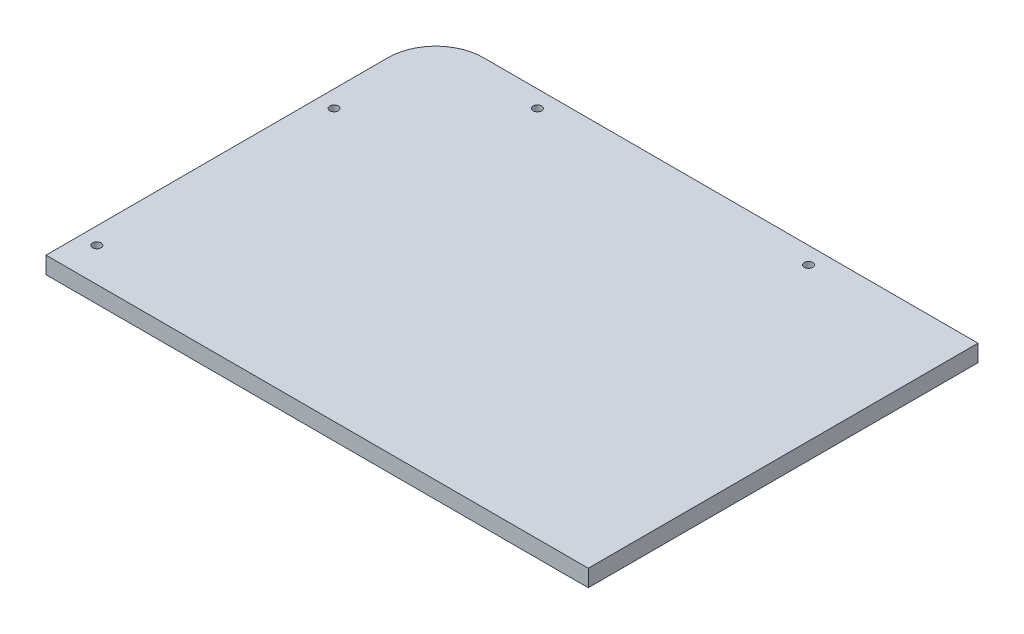
ISO-10303-21;
HEADER;
FILE_DESCRIPTION(('STEP AP214'),'2;1');
FILE_NAME('part.step','',(''),(''),'','','');
FILE_SCHEMA(('AUTOMOTIVE_DESIGN { 1 0 10303 214 1 1 1 1 }'));
ENDSEC;
DATA;
#1=APPLICATION_CONTEXT('core data for automotive mechanical design processes');
#2=APPLICATION_PROTOCOL_DEFINITION('international standard','automotive_design',2000,#1);
#3=PRODUCT_CONTEXT('',#1,'mechanical');
#4=PRODUCT('Part','Part','',(#3));
#5=PRODUCT_RELATED_PRODUCT_CATEGORY('part','',(#4));
#6=PRODUCT_DEFINITION_FORMATION('','',#4);
#7=PRODUCT_DEFINITION_CONTEXT('part definition',#1,'design');
#8=PRODUCT_DEFINITION('design','',#6,#7);
#9=PRODUCT_DEFINITION_SHAPE('','',#8);
#10=(LENGTH_UNIT() NAMED_UNIT(*) SI_UNIT(.MILLI.,.METRE.));
#11=(NAMED_UNIT(*) PLANE_ANGLE_UNIT() SI_UNIT($,.RADIAN.));
#12=(NAMED_UNIT(*) SI_UNIT($,.STERADIAN.) SOLID_ANGLE_UNIT());
#13=UNCERTAINTY_MEASURE_WITH_UNIT(LENGTH_MEASURE(1.E-05),#10,'distance_accuracy_value','');
#14=(GEOMETRIC_REPRESENTATION_CONTEXT(3) GLOBAL_UNCERTAINTY_ASSIGNED_CONTEXT((#13)) GLOBAL_UNIT_ASSIGNED_CONTEXT((#10,
#11,#12)) REPRESENTATION_CONTEXT('',''));
#15=CARTESIAN_POINT('',(0.,0.,0.));
#16=DIRECTION('',(0.,0.,1.));
#17=DIRECTION('',(1.,0.,0.));
#18=AXIS2_PLACEMENT_3D('',#15,#16,#17);
#19=CARTESIAN_POINT('',(17.78,6.35,-128.27));
#20=DIRECTION('',(0.,1.,0.));
#21=DIRECTION('',(0.,0.,1.));
#22=AXIS2_PLACEMENT_3D('',#19,#20,#21);
#23=PLANE('',#22);
#24=CARTESIAN_POINT('',(44.45,6.35,-139.7));
#25=DIRECTION('',(0.,1.,0.));
#26=DIRECTION('',(0.,0.,1.));
#27=AXIS2_PLACEMENT_3D('',#24,#25,#26);
#28=CIRCLE('',#27,1.5875);
#29=CARTESIAN_POINT('',(44.45,6.35,-138.1125));
#30=VERTEX_POINT('',#29);
#31=EDGE_CURVE('E173',#30,#30,#28,.T.);
#32=ORIENTED_EDGE('',*,*,#31,.F.);
#33=EDGE_LOOP('',(#32));
#34=FACE_BOUND('',#33,.T.);
#35=CARTESIAN_POINT('',(6.35,6.35,-12.7));
#36=DIRECTION('',(0.,1.,0.));
#37=DIRECTION('',(0.,0.,1.));
#38=AXIS2_PLACEMENT_3D('',#35,#36,#37);
#39=CIRCLE('',#38,1.5875);
#40=CARTESIAN_POINT('',(6.35,6.35,-11.1125));
#41=VERTEX_POINT('',#40);
#42=EDGE_CURVE('E112',#41,#41,#39,.T.);
#43=ORIENTED_EDGE('',*,*,#42,.F.);
#44=EDGE_LOOP('',(#43));
#45=FACE_BOUND('',#44,.T.);
#46=DIRECTION('',(0.,0.,1.));
#47=VECTOR('',#46,1.);
#48=CARTESIAN_POINT('',(0.,6.35,0.));
#49=LINE('',#48,#47);
#50=CARTESIAN_POINT('',(0.,6.35,-128.27));
#51=VERTEX_POINT('',#50);
#52=CARTESIAN_POINT('',(0.,6.35,0.));
#53=VERTEX_POINT('',#52);
#54=EDGE_CURVE('E117',#51,#53,#49,.T.);
#55=ORIENTED_EDGE('',*,*,#54,.T.);
#56=DIRECTION('',(1.,0.,0.));
#57=VECTOR('',#56,1.);
#58=CARTESIAN_POINT('',(0.,6.35,0.));
#59=LINE('',#58,#57);
#60=CARTESIAN_POINT('',(203.2,6.35,0.));
#61=VERTEX_POINT('',#60);
#62=EDGE_CURVE('E84',#53,#61,#59,.T.);
#63=ORIENTED_EDGE('',*,*,#62,.T.);
#64=DIRECTION('',(0.,0.,-1.));
#65=VECTOR('',#64,1.);
#66=CARTESIAN_POINT('',(203.2,6.35,0.));
#67=LINE('',#66,#65);
#68=CARTESIAN_POINT('',(203.2,6.35,-146.05));
#69=VERTEX_POINT('',#68);
#70=EDGE_CURVE('E88',#61,#69,#67,.T.);
#71=ORIENTED_EDGE('',*,*,#70,.T.);
#72=DIRECTION('',(-1.,0.,0.));
#73=VECTOR('',#72,1.);
#74=CARTESIAN_POINT('',(17.7800000000001,6.35,-146.05));
#75=LINE('',#74,#73);
#76=CARTESIAN_POINT('',(17.7800000000001,6.35,-146.05));
#77=VERTEX_POINT('',#76);
#78=EDGE_CURVE('E92',#69,#77,#75,.T.);
#79=ORIENTED_EDGE('',*,*,#78,.T.);
#80=CARTESIAN_POINT('',(17.78,6.35,-128.27));
#81=DIRECTION('',(0.,1.,0.));
#82=DIRECTION('',(0.,0.,1.));
#83=AXIS2_PLACEMENT_3D('',#80,#81,#82);
#84=CIRCLE('',#83,17.78);
#85=EDGE_CURVE('E50',#77,#51,#84,.T.);
#86=ORIENTED_EDGE('',*,*,#85,.T.);
#87=EDGE_LOOP('',(#55,#63,#71,#79,#86));
#88=FACE_BOUND('',#87,.T.);
#89=CARTESIAN_POINT('',(6.35,6.35,-101.6));
#90=DIRECTION('',(0.,1.,0.));
#91=DIRECTION('',(0.,0.,1.));
#92=AXIS2_PLACEMENT_3D('',#89,#90,#91);
#93=CIRCLE('',#92,1.5875);
#94=CARTESIAN_POINT('',(6.35,6.35,-100.0125));
#95=VERTEX_POINT('',#94);
#96=EDGE_CURVE('E179',#95,#95,#93,.T.);
#97=ORIENTED_EDGE('',*,*,#96,.F.);
#98=EDGE_LOOP('',(#97));
#99=FACE_BOUND('',#98,.T.);
#100=CARTESIAN_POINT('',(146.05,6.35,-139.7));
#101=DIRECTION('',(0.,1.,0.));
#102=DIRECTION('',(0.,0.,1.));
#103=AXIS2_PLACEMENT_3D('',#100,#101,#102);
#104=CIRCLE('',#103,1.58749999999999);
#105=CARTESIAN_POINT('',(146.05,6.35,-138.1125));
#106=VERTEX_POINT('',#105);
#107=EDGE_CURVE('E164',#106,#106,#104,.T.);
#108=ORIENTED_EDGE('',*,*,#107,.F.);
#109=EDGE_LOOP('',(#108));
#110=FACE_BOUND('',#109,.T.);
#111=ADVANCED_FACE('F33',(#34,#45,#88,#99,#110),#23,.T.);
#112=CARTESIAN_POINT('',(17.78,0.,-128.27));
#113=DIRECTION('',(0.,1.,0.));
#114=DIRECTION('',(0.,0.,1.));
#115=AXIS2_PLACEMENT_3D('',#112,#113,#114);
#116=PLANE('',#115);
#117=CARTESIAN_POINT('',(44.45,0.,-139.7));
#118=DIRECTION('',(0.,1.,0.));
#119=DIRECTION('',(0.,0.,1.));
#120=AXIS2_PLACEMENT_3D('',#117,#118,#119);
#121=CIRCLE('',#120,1.5875);
#122=CARTESIAN_POINT('',(44.45,0.,-138.1125));
#123=VERTEX_POINT('',#122);
#124=EDGE_CURVE('E170',#123,#123,#121,.T.);
#125=ORIENTED_EDGE('',*,*,#124,.T.);
#126=EDGE_LOOP('',(#125));
#127=FACE_BOUND('',#126,.T.);
#128=CARTESIAN_POINT('',(6.35,0.,-12.7));
#129=DIRECTION('',(0.,1.,0.));
#130=DIRECTION('',(0.,0.,1.));
#131=AXIS2_PLACEMENT_3D('',#128,#129,#130);
#132=CIRCLE('',#131,1.5875);
#133=CARTESIAN_POINT('',(6.35,0.,-11.1125));
#134=VERTEX_POINT('',#133);
#135=EDGE_CURVE('E182',#134,#134,#132,.T.);
#136=ORIENTED_EDGE('',*,*,#135,.T.);
#137=EDGE_LOOP('',(#136));
#138=FACE_BOUND('',#137,.T.);
#139=DIRECTION('',(0.,0.,1.));
#140=VECTOR('',#139,1.);
#141=CARTESIAN_POINT('',(0.,0.,0.));
#142=LINE('',#141,#140);
#143=CARTESIAN_POINT('',(0.,0.,-128.27));
#144=VERTEX_POINT('',#143);
#145=CARTESIAN_POINT('',(0.,0.,0.));
#146=VERTEX_POINT('',#145);
#147=EDGE_CURVE('E108',#144,#146,#142,.T.);
#148=ORIENTED_EDGE('',*,*,#147,.F.);
#149=CARTESIAN_POINT('',(17.78,0.,-128.27));
#150=DIRECTION('',(0.,1.,0.));
#151=DIRECTION('',(0.,0.,1.));
#152=AXIS2_PLACEMENT_3D('',#149,#150,#151);
#153=CIRCLE('',#152,17.78);
#154=CARTESIAN_POINT('',(17.7800000000001,0.,-146.05));
#155=VERTEX_POINT('',#154);
#156=EDGE_CURVE('E76',#155,#144,#153,.T.);
#157=ORIENTED_EDGE('',*,*,#156,.F.);
#158=DIRECTION('',(-1.,0.,0.));
#159=VECTOR('',#158,1.);
#160=CARTESIAN_POINT('',(17.7800000000001,0.,-146.05));
#161=LINE('',#160,#159);
#162=CARTESIAN_POINT('',(203.2,0.,-146.05));
#163=VERTEX_POINT('',#162);
#164=EDGE_CURVE('E70',#163,#155,#161,.T.);
#165=ORIENTED_EDGE('',*,*,#164,.F.);
#166=DIRECTION('',(0.,0.,-1.));
#167=VECTOR('',#166,1.);
#168=CARTESIAN_POINT('',(203.2,0.,0.));
#169=LINE('',#168,#167);
#170=CARTESIAN_POINT('',(203.2,0.,0.));
#171=VERTEX_POINT('',#170);
#172=EDGE_CURVE('E99',#171,#163,#169,.T.);
#173=ORIENTED_EDGE('',*,*,#172,.F.);
#174=DIRECTION('',(1.,0.,0.));
#175=VECTOR('',#174,1.);
#176=CARTESIAN_POINT('',(0.,0.,0.));
#177=LINE('',#176,#175);
#178=EDGE_CURVE('E111',#146,#171,#177,.T.);
#179=ORIENTED_EDGE('',*,*,#178,.F.);
#180=EDGE_LOOP('',(#148,#157,#165,#173,#179));
#181=FACE_BOUND('',#180,.T.);
#182=CARTESIAN_POINT('',(6.35,0.,-101.6));
#183=DIRECTION('',(0.,1.,0.));
#184=DIRECTION('',(0.,0.,1.));
#185=AXIS2_PLACEMENT_3D('',#182,#183,#184);
#186=CIRCLE('',#185,1.5875);
#187=CARTESIAN_POINT('',(6.35,0.,-100.0125));
#188=VERTEX_POINT('',#187);
#189=EDGE_CURVE('E176',#188,#188,#186,.T.);
#190=ORIENTED_EDGE('',*,*,#189,.T.);
#191=EDGE_LOOP('',(#190));
#192=FACE_BOUND('',#191,.T.);
#193=CARTESIAN_POINT('',(146.05,0.,-139.7));
#194=DIRECTION('',(0.,1.,0.));
#195=DIRECTION('',(0.,0.,1.));
#196=AXIS2_PLACEMENT_3D('',#193,#194,#195);
#197=CIRCLE('',#196,1.58749999999999);
#198=CARTESIAN_POINT('',(146.05,0.,-138.1125));
#199=VERTEX_POINT('',#198);
#200=EDGE_CURVE('E167',#199,#199,#197,.T.);
#201=ORIENTED_EDGE('',*,*,#200,.T.);
#202=EDGE_LOOP('',(#201));
#203=FACE_BOUND('',#202,.T.);
#204=ADVANCED_FACE('F121',(#127,#138,#181,#192,#203),#116,.F.);
#205=CARTESIAN_POINT('',(0.,6.35,0.));
#206=DIRECTION('',(1.,0.,0.));
#207=DIRECTION('',(0.,0.,-1.));
#208=AXIS2_PLACEMENT_3D('',#205,#206,#207);
#209=PLANE('',#208);
#210=ORIENTED_EDGE('',*,*,#147,.T.);
#211=DIRECTION('',(0.,-1.,0.));
#212=VECTOR('',#211,1.);
#213=CARTESIAN_POINT('',(0.,6.35,0.));
#214=LINE('',#213,#212);
#215=EDGE_CURVE('E11',#53,#146,#214,.T.);
#216=ORIENTED_EDGE('',*,*,#215,.F.);
#217=ORIENTED_EDGE('',*,*,#54,.F.);
#218=DIRECTION('',(0.,-1.,0.));
#219=VECTOR('',#218,1.);
#220=CARTESIAN_POINT('',(0.,6.35,-128.27));
#221=LINE('',#220,#219);
#222=EDGE_CURVE('E104',#51,#144,#221,.T.);
#223=ORIENTED_EDGE('',*,*,#222,.T.);
#224=EDGE_LOOP('',(#210,#216,#217,#223));
#225=FACE_BOUND('',#224,.T.);
#226=ADVANCED_FACE('F35',(#225),#209,.F.);
#227=CARTESIAN_POINT('',(0.,6.35,0.));
#228=DIRECTION('',(0.,0.,-1.));
#229=DIRECTION('',(-1.,0.,0.));
#230=AXIS2_PLACEMENT_3D('',#227,#228,#229);
#231=PLANE('',#230);
#232=ORIENTED_EDGE('',*,*,#178,.T.);
#233=DIRECTION('',(0.,-1.,0.));
#234=VECTOR('',#233,1.);
#235=CARTESIAN_POINT('',(203.2,6.35,0.));
#236=LINE('',#235,#234);
#237=EDGE_CURVE('E42',#61,#171,#236,.T.);
#238=ORIENTED_EDGE('',*,*,#237,.F.);
#239=ORIENTED_EDGE('',*,*,#62,.F.);
#240=ORIENTED_EDGE('',*,*,#215,.T.);
#241=EDGE_LOOP('',(#232,#238,#239,#240));
#242=FACE_BOUND('',#241,.T.);
#243=ADVANCED_FACE('F230',(#242),#231,.F.);
#244=CARTESIAN_POINT('',(203.2,6.35,0.));
#245=DIRECTION('',(-1.,0.,0.));
#246=DIRECTION('',(0.,0.,1.));
#247=AXIS2_PLACEMENT_3D('',#244,#245,#246);
#248=PLANE('',#247);
#249=ORIENTED_EDGE('',*,*,#172,.T.);
#250=DIRECTION('',(0.,-1.,0.));
#251=VECTOR('',#250,1.);
#252=CARTESIAN_POINT('',(203.2,6.35,-146.05));
#253=LINE('',#252,#251);
#254=EDGE_CURVE('E96',#69,#163,#253,.T.);
#255=ORIENTED_EDGE('',*,*,#254,.F.);
#256=ORIENTED_EDGE('',*,*,#70,.F.);
#257=ORIENTED_EDGE('',*,*,#237,.T.);
#258=EDGE_LOOP('',(#249,#255,#256,#257));
#259=FACE_BOUND('',#258,.T.);
#260=ADVANCED_FACE('F97',(#259),#248,.F.);
#261=CARTESIAN_POINT('',(17.7800000000001,6.35,-146.05));
#262=DIRECTION('',(0.,0.,1.));
#263=DIRECTION('',(1.,0.,0.));
#264=AXIS2_PLACEMENT_3D('',#261,#262,#263);
#265=PLANE('',#264);
#266=ORIENTED_EDGE('',*,*,#164,.T.);
#267=DIRECTION('',(0.,-1.,0.));
#268=VECTOR('',#267,1.);
#269=CARTESIAN_POINT('',(17.7800000000001,6.35,-146.05));
#270=LINE('',#269,#268);
#271=EDGE_CURVE('E100',#77,#155,#270,.T.);
#272=ORIENTED_EDGE('',*,*,#271,.F.);
#273=ORIENTED_EDGE('',*,*,#78,.F.);
#274=ORIENTED_EDGE('',*,*,#254,.T.);
#275=EDGE_LOOP('',(#266,#272,#273,#274));
#276=FACE_BOUND('',#275,.T.);
#277=ADVANCED_FACE('F102',(#276),#265,.F.);
#278=CARTESIAN_POINT('',(17.78,6.35,-128.27));
#279=DIRECTION('',(0.,-1.,0.));
#280=DIRECTION('',(0.,0.,-1.));
#281=AXIS2_PLACEMENT_3D('',#278,#279,#280);
#282=CYLINDRICAL_SURFACE('',#281,17.78);
#283=ORIENTED_EDGE('',*,*,#156,.T.);
#284=ORIENTED_EDGE('',*,*,#222,.F.);
#285=ORIENTED_EDGE('',*,*,#85,.F.);
#286=ORIENTED_EDGE('',*,*,#271,.T.);
#287=EDGE_LOOP('',(#283,#284,#285,#286));
#288=FACE_BOUND('',#287,.T.);
#289=ADVANCED_FACE('F126',(#288),#282,.T.);
#290=CARTESIAN_POINT('',(6.35,6.35,-12.7));
#291=DIRECTION('',(0.,-1.,0.));
#292=DIRECTION('',(0.,0.,-1.));
#293=AXIS2_PLACEMENT_3D('',#290,#291,#292);
#294=CYLINDRICAL_SURFACE('',#293,1.5875);
#295=ORIENTED_EDGE('',*,*,#42,.T.);
#296=EDGE_LOOP('',(#295));
#297=FACE_BOUND('',#296,.T.);
#298=ORIENTED_EDGE('',*,*,#135,.F.);
#299=EDGE_LOOP('',(#298));
#300=FACE_BOUND('',#299,.T.);
#301=ADVANCED_FACE('F128',(#297,#300),#294,.F.);
#302=CARTESIAN_POINT('',(6.35,6.35,-101.6));
#303=DIRECTION('',(0.,-1.,0.));
#304=DIRECTION('',(0.,0.,-1.));
#305=AXIS2_PLACEMENT_3D('',#302,#303,#304);
#306=CYLINDRICAL_SURFACE('',#305,1.5875);
#307=ORIENTED_EDGE('',*,*,#96,.T.);
#308=EDGE_LOOP('',(#307));
#309=FACE_BOUND('',#308,.T.);
#310=ORIENTED_EDGE('',*,*,#189,.F.);
#311=EDGE_LOOP('',(#310));
#312=FACE_BOUND('',#311,.T.);
#313=ADVANCED_FACE('F134',(#309,#312),#306,.F.);
#314=CARTESIAN_POINT('',(44.45,6.35,-139.7));
#315=DIRECTION('',(0.,-1.,0.));
#316=DIRECTION('',(0.,0.,-1.));
#317=AXIS2_PLACEMENT_3D('',#314,#315,#316);
#318=CYLINDRICAL_SURFACE('',#317,1.5875);
#319=ORIENTED_EDGE('',*,*,#31,.T.);
#320=EDGE_LOOP('',(#319));
#321=FACE_BOUND('',#320,.T.);
#322=ORIENTED_EDGE('',*,*,#124,.F.);
#323=EDGE_LOOP('',(#322));
#324=FACE_BOUND('',#323,.T.);
#325=ADVANCED_FACE('F151',(#321,#324),#318,.F.);
#326=CARTESIAN_POINT('',(146.05,6.35,-139.7));
#327=DIRECTION('',(0.,-1.,0.));
#328=DIRECTION('',(0.,0.,-1.));
#329=AXIS2_PLACEMENT_3D('',#326,#327,#328);
#330=CYLINDRICAL_SURFACE('',#329,1.58749999999999);
#331=ORIENTED_EDGE('',*,*,#107,.T.);
#332=EDGE_LOOP('',(#331));
#333=FACE_BOUND('',#332,.T.);
#334=ORIENTED_EDGE('',*,*,#200,.F.);
#335=EDGE_LOOP('',(#334));
#336=FACE_BOUND('',#335,.T.);
#337=ADVANCED_FACE('F155',(#333,#336),#330,.F.);
#338=CLOSED_SHELL('',(#111,#204,#226,#243,#260,#277,#289,#301,#313,#325,#337));
#339=MANIFOLD_SOLID_BREP('B2',#338);
#340=ADVANCED_BREP_SHAPE_REPRESENTATION('',(#18,#339),#14);
#341=SHAPE_DEFINITION_REPRESENTATION(#9,#340);
ENDSEC;
END-ISO-10303-21;
